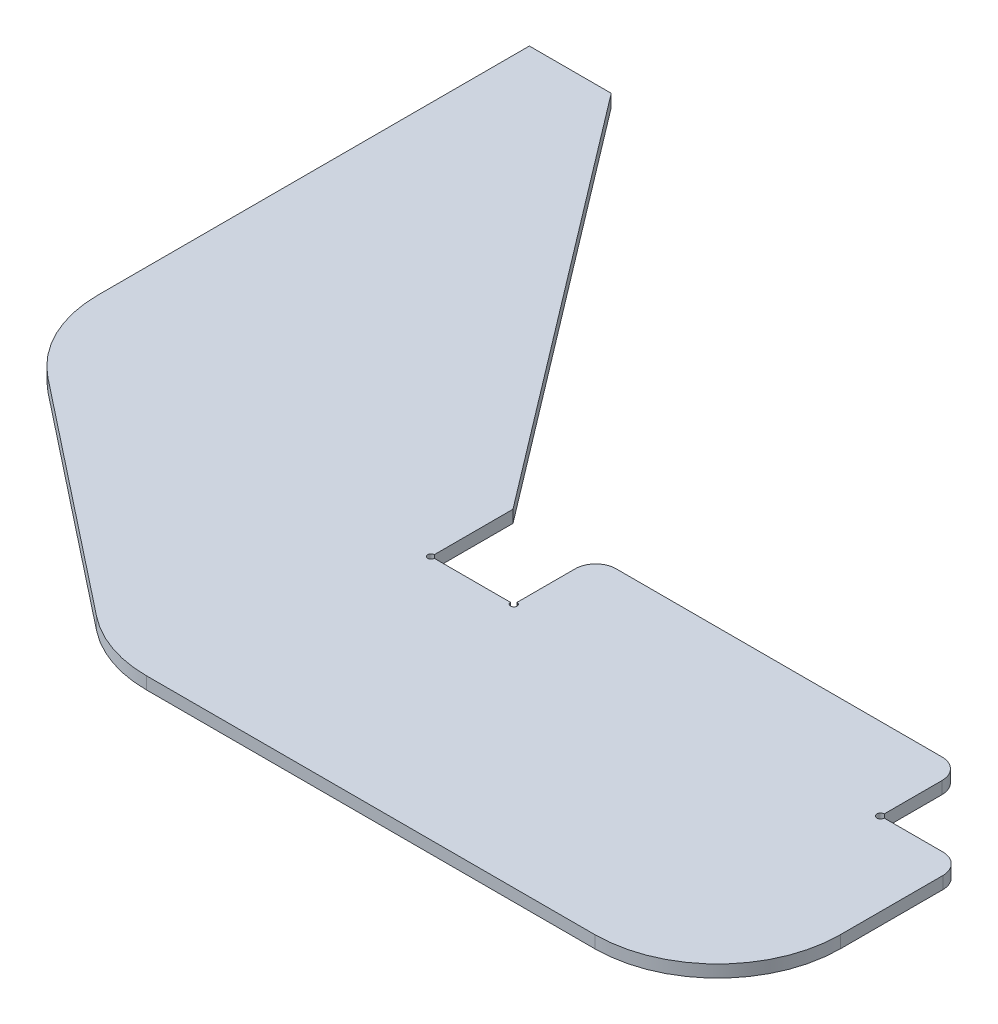
ISO-10303-21;
HEADER;
FILE_DESCRIPTION(('STEP AP214'),'2;1');
FILE_NAME('part.step','',(''),(''),'','','');
FILE_SCHEMA(('AUTOMOTIVE_DESIGN { 1 0 10303 214 1 1 1 1 }'));
ENDSEC;
DATA;
#1=APPLICATION_CONTEXT('core data for automotive mechanical design processes');
#2=APPLICATION_PROTOCOL_DEFINITION('international standard','automotive_design',2000,#1);
#3=PRODUCT_CONTEXT('',#1,'mechanical');
#4=PRODUCT('Part','Part','',(#3));
#5=PRODUCT_RELATED_PRODUCT_CATEGORY('part','',(#4));
#6=PRODUCT_DEFINITION_FORMATION('','',#4);
#7=PRODUCT_DEFINITION_CONTEXT('part definition',#1,'design');
#8=PRODUCT_DEFINITION('design','',#6,#7);
#9=PRODUCT_DEFINITION_SHAPE('','',#8);
#10=(LENGTH_UNIT() NAMED_UNIT(*) SI_UNIT(.MILLI.,.METRE.));
#11=(NAMED_UNIT(*) PLANE_ANGLE_UNIT() SI_UNIT($,.RADIAN.));
#12=(NAMED_UNIT(*) SI_UNIT($,.STERADIAN.) SOLID_ANGLE_UNIT());
#13=UNCERTAINTY_MEASURE_WITH_UNIT(LENGTH_MEASURE(1.E-05),#10,'distance_accuracy_value','');
#14=(GEOMETRIC_REPRESENTATION_CONTEXT(3) GLOBAL_UNCERTAINTY_ASSIGNED_CONTEXT((#13)) GLOBAL_UNIT_ASSIGNED_CONTEXT((#10,
#11,#12)) REPRESENTATION_CONTEXT('',''));
#15=CARTESIAN_POINT('',(0.,0.,0.));
#16=DIRECTION('',(0.,0.,1.));
#17=DIRECTION('',(1.,0.,0.));
#18=AXIS2_PLACEMENT_3D('',#15,#16,#17);
#19=CARTESIAN_POINT('',(-75.,3.,-30.));
#20=DIRECTION('',(0.,0.,1.));
#21=DIRECTION('',(1.,0.,0.));
#22=AXIS2_PLACEMENT_3D('',#19,#20,#21);
#23=PLANE('',#22);
#24=DIRECTION('',(-1.,0.,0.));
#25=VECTOR('',#24,1.);
#26=CARTESIAN_POINT('',(-75.,0.,-30.));
#27=LINE('',#26,#25);
#28=CARTESIAN_POINT('',(-35.6,0.,-30.));
#29=VERTEX_POINT('',#28);
#30=CARTESIAN_POINT('',(-54.2,0.,-30.));
#31=VERTEX_POINT('',#30);
#32=EDGE_CURVE('E224',#29,#31,#27,.T.);
#33=ORIENTED_EDGE('',*,*,#32,.T.);
#34=DIRECTION('',(0.,1.,0.));
#35=VECTOR('',#34,1.);
#36=CARTESIAN_POINT('',(-54.2,0.,-30.));
#37=LINE('',#36,#35);
#38=CARTESIAN_POINT('',(-54.2,3.,-30.));
#39=VERTEX_POINT('',#38);
#40=EDGE_CURVE('E317',#31,#39,#37,.T.);
#41=ORIENTED_EDGE('',*,*,#40,.T.);
#42=DIRECTION('',(-1.,0.,0.));
#43=VECTOR('',#42,1.);
#44=CARTESIAN_POINT('',(-75.,3.,-30.));
#45=LINE('',#44,#43);
#46=CARTESIAN_POINT('',(-35.6,3.,-30.));
#47=VERTEX_POINT('',#46);
#48=EDGE_CURVE('E214',#47,#39,#45,.T.);
#49=ORIENTED_EDGE('',*,*,#48,.F.);
#50=DIRECTION('',(0.,1.,0.));
#51=VECTOR('',#50,1.);
#52=CARTESIAN_POINT('',(-35.6,0.,-30.));
#53=LINE('',#52,#51);
#54=EDGE_CURVE('E359',#47,#29,#53,.F.);
#55=ORIENTED_EDGE('',*,*,#54,.T.);
#56=EDGE_LOOP('',(#33,#41,#49,#55));
#57=FACE_BOUND('',#56,.T.);
#58=ADVANCED_FACE('F35',(#57),#23,.F.);
#59=CARTESIAN_POINT('',(75.,3.,30.));
#60=DIRECTION('',(-1.,0.,0.));
#61=DIRECTION('',(0.,0.,1.));
#62=AXIS2_PLACEMENT_3D('',#59,#60,#61);
#63=PLANE('',#62);
#64=DIRECTION('',(0.,0.,-1.));
#65=VECTOR('',#64,1.);
#66=CARTESIAN_POINT('',(75.,0.,30.));
#67=LINE('',#66,#65);
#68=CARTESIAN_POINT('',(75.,0.,0.));
#69=VERTEX_POINT('',#68);
#70=CARTESIAN_POINT('',(75.,0.,-25.));
#71=VERTEX_POINT('',#70);
#72=EDGE_CURVE('E221',#69,#71,#67,.T.);
#73=ORIENTED_EDGE('',*,*,#72,.T.);
#74=DIRECTION('',(0.,-1.,0.));
#75=VECTOR('',#74,1.);
#76=CARTESIAN_POINT('',(75.,3.,-25.));
#77=LINE('',#76,#75);
#78=CARTESIAN_POINT('',(75.,3.,-25.));
#79=VERTEX_POINT('',#78);
#80=EDGE_CURVE('E271',#71,#79,#77,.F.);
#81=ORIENTED_EDGE('',*,*,#80,.T.);
#82=DIRECTION('',(0.,0.,-1.));
#83=VECTOR('',#82,1.);
#84=CARTESIAN_POINT('',(75.,3.,30.));
#85=LINE('',#84,#83);
#86=CARTESIAN_POINT('',(75.,3.,0.));
#87=VERTEX_POINT('',#86);
#88=EDGE_CURVE('E211',#87,#79,#85,.T.);
#89=ORIENTED_EDGE('',*,*,#88,.F.);
#90=DIRECTION('',(0.,-1.,0.));
#91=VECTOR('',#90,1.);
#92=CARTESIAN_POINT('',(75.,3.,0.));
#93=LINE('',#92,#91);
#94=EDGE_CURVE('E220',#87,#69,#93,.T.);
#95=ORIENTED_EDGE('',*,*,#94,.T.);
#96=EDGE_LOOP('',(#73,#81,#89,#95));
#97=FACE_BOUND('',#96,.T.);
#98=ADVANCED_FACE('F383',(#97),#63,.F.);
#99=CARTESIAN_POINT('',(70.,3.,-30.));
#100=VERTEX_POINT('',#99);
#101=CARTESIAN_POINT('',(55.6994021051872,3.,-30.));
#102=VERTEX_POINT('',#101);
#103=EDGE_CURVE('E216',#100,#102,#45,.T.);
#104=ORIENTED_EDGE('',*,*,#103,.F.);
#105=DIRECTION('',(0.,-1.,0.));
#106=VECTOR('',#105,1.);
#107=CARTESIAN_POINT('',(70.,3.,-30.));
#108=LINE('',#107,#106);
#109=CARTESIAN_POINT('',(70.,0.,-30.));
#110=VERTEX_POINT('',#109);
#111=EDGE_CURVE('E262',#100,#110,#108,.T.);
#112=ORIENTED_EDGE('',*,*,#111,.T.);
#113=CARTESIAN_POINT('',(55.6994021051872,0.,-30.));
#114=VERTEX_POINT('',#113);
#115=EDGE_CURVE('E225',#110,#114,#27,.T.);
#116=ORIENTED_EDGE('',*,*,#115,.T.);
#117=DIRECTION('',(0.,1.,0.));
#118=VECTOR('',#117,1.);
#119=CARTESIAN_POINT('',(55.6994021051872,0.,-30.));
#120=LINE('',#119,#118);
#121=EDGE_CURVE('E345',#114,#102,#120,.T.);
#122=ORIENTED_EDGE('',*,*,#121,.T.);
#123=EDGE_LOOP('',(#104,#112,#116,#122));
#124=FACE_BOUND('',#123,.T.);
#125=ADVANCED_FACE('F385',(#124),#23,.F.);
#126=CARTESIAN_POINT('',(-75.,3.,30.));
#127=DIRECTION('',(0.,0.,-1.));
#128=DIRECTION('',(-1.,0.,0.));
#129=AXIS2_PLACEMENT_3D('',#126,#127,#128);
#130=PLANE('',#129);
#131=DIRECTION('',(1.,0.,0.));
#132=VECTOR('',#131,1.);
#133=CARTESIAN_POINT('',(-75.,3.,30.));
#134=LINE('',#133,#132);
#135=CARTESIAN_POINT('',(-64.5851262523592,3.,30.));
#136=VERTEX_POINT('',#135);
#137=CARTESIAN_POINT('',(45.,3.,30.));
#138=VERTEX_POINT('',#137);
#139=EDGE_CURVE('E218',#136,#138,#134,.T.);
#140=ORIENTED_EDGE('',*,*,#139,.F.);
#141=DIRECTION('',(0.,-1.,0.));
#142=VECTOR('',#141,1.);
#143=CARTESIAN_POINT('',(-64.5851262523592,0.,30.));
#144=LINE('',#143,#142);
#145=CARTESIAN_POINT('',(-64.5851262523592,0.,30.));
#146=VERTEX_POINT('',#145);
#147=EDGE_CURVE('E238',#136,#146,#144,.T.);
#148=ORIENTED_EDGE('',*,*,#147,.T.);
#149=DIRECTION('',(1.,0.,0.));
#150=VECTOR('',#149,1.);
#151=CARTESIAN_POINT('',(-75.,0.,30.));
#152=LINE('',#151,#150);
#153=CARTESIAN_POINT('',(45.,0.,30.));
#154=VERTEX_POINT('',#153);
#155=EDGE_CURVE('E215',#146,#154,#152,.T.);
#156=ORIENTED_EDGE('',*,*,#155,.T.);
#157=DIRECTION('',(0.,-1.,0.));
#158=VECTOR('',#157,1.);
#159=CARTESIAN_POINT('',(45.,3.,30.));
#160=LINE('',#159,#158);
#161=EDGE_CURVE('E233',#154,#138,#160,.F.);
#162=ORIENTED_EDGE('',*,*,#161,.T.);
#163=EDGE_LOOP('',(#140,#148,#156,#162));
#164=FACE_BOUND('',#163,.T.);
#165=ADVANCED_FACE('F393',(#164),#130,.F.);
#166=CARTESIAN_POINT('',(0.,3.,0.));
#167=DIRECTION('',(0.,-1.,0.));
#168=DIRECTION('',(0.,0.,-1.));
#169=AXIS2_PLACEMENT_3D('',#166,#167,#168);
#170=PLANE('',#169);
#171=ORIENTED_EDGE('',*,*,#88,.T.);
#172=CARTESIAN_POINT('',(70.,3.,-25.));
#173=DIRECTION('',(0.,-1.,0.));
#174=DIRECTION('',(0.,0.,-1.));
#175=AXIS2_PLACEMENT_3D('',#172,#173,#174);
#176=CIRCLE('',#175,5.);
#177=EDGE_CURVE('E276',#79,#100,#176,.F.);
#178=ORIENTED_EDGE('',*,*,#177,.T.);
#179=ORIENTED_EDGE('',*,*,#103,.T.);
#180=CARTESIAN_POINT('',(54.8,3.,-30.));
#181=DIRECTION('',(0.,1.,0.));
#182=DIRECTION('',(0.,0.,1.));
#183=AXIS2_PLACEMENT_3D('',#180,#181,#182);
#184=CIRCLE('',#183,0.899402105187145);
#185=CARTESIAN_POINT('',(54.8,3.,-30.8994021051871));
#186=VERTEX_POINT('',#185);
#187=EDGE_CURVE('E310',#186,#102,#184,.T.);
#188=ORIENTED_EDGE('',*,*,#187,.F.);
#189=DIRECTION('',(0.,0.,-1.));
#190=VECTOR('',#189,1.);
#191=CARTESIAN_POINT('',(54.8,3.,0.));
#192=LINE('',#191,#190);
#193=CARTESIAN_POINT('',(54.8,3.,-45.));
#194=VERTEX_POINT('',#193);
#195=EDGE_CURVE('E306',#186,#194,#192,.T.);
#196=ORIENTED_EDGE('',*,*,#195,.T.);
#197=CARTESIAN_POINT('',(49.8,3.,-45.));
#198=DIRECTION('',(0.,-1.,0.));
#199=DIRECTION('',(0.,0.,-1.));
#200=AXIS2_PLACEMENT_3D('',#197,#198,#199);
#201=CIRCLE('',#200,5.);
#202=CARTESIAN_POINT('',(49.8,3.,-50.));
#203=VERTEX_POINT('',#202);
#204=EDGE_CURVE('E274',#194,#203,#201,.F.);
#205=ORIENTED_EDGE('',*,*,#204,.T.);
#206=DIRECTION('',(-1.,0.,0.));
#207=VECTOR('',#206,1.);
#208=CARTESIAN_POINT('',(0.,3.,-50.));
#209=LINE('',#208,#207);
#210=CARTESIAN_POINT('',(-29.8,3.,-50.));
#211=VERTEX_POINT('',#210);
#212=EDGE_CURVE('E289',#203,#211,#209,.T.);
#213=ORIENTED_EDGE('',*,*,#212,.T.);
#214=CARTESIAN_POINT('',(-29.8,3.,-45.));
#215=DIRECTION('',(0.,-1.,0.));
#216=DIRECTION('',(0.,0.,-1.));
#217=AXIS2_PLACEMENT_3D('',#214,#215,#216);
#218=CIRCLE('',#217,5.);
#219=CARTESIAN_POINT('',(-34.8,3.,-45.));
#220=VERTEX_POINT('',#219);
#221=EDGE_CURVE('E50',#211,#220,#218,.F.);
#222=ORIENTED_EDGE('',*,*,#221,.T.);
#223=DIRECTION('',(0.,0.,-1.));
#224=VECTOR('',#223,1.);
#225=CARTESIAN_POINT('',(-34.8,3.,0.));
#226=LINE('',#225,#224);
#227=CARTESIAN_POINT('',(-34.8,3.,-30.8));
#228=VERTEX_POINT('',#227);
#229=EDGE_CURVE('E297',#228,#220,#226,.T.);
#230=ORIENTED_EDGE('',*,*,#229,.F.);
#231=CARTESIAN_POINT('',(-34.8,3.,-30.));
#232=DIRECTION('',(0.,1.,0.));
#233=DIRECTION('',(0.,0.,1.));
#234=AXIS2_PLACEMENT_3D('',#231,#232,#233);
#235=CIRCLE('',#234,0.800000000000003);
#236=EDGE_CURVE('E351',#47,#228,#235,.T.);
#237=ORIENTED_EDGE('',*,*,#236,.F.);
#238=ORIENTED_EDGE('',*,*,#48,.T.);
#239=CARTESIAN_POINT('',(-55.,3.,-30.));
#240=DIRECTION('',(0.,1.,0.));
#241=DIRECTION('',(0.,0.,1.));
#242=AXIS2_PLACEMENT_3D('',#239,#240,#241);
#243=CIRCLE('',#242,0.800000000000003);
#244=CARTESIAN_POINT('',(-55.,3.,-30.8));
#245=VERTEX_POINT('',#244);
#246=EDGE_CURVE('E346',#245,#39,#243,.T.);
#247=ORIENTED_EDGE('',*,*,#246,.F.);
#248=DIRECTION('',(0.,0.,-1.));
#249=VECTOR('',#248,1.);
#250=CARTESIAN_POINT('',(-55.,3.,0.));
#251=LINE('',#250,#249);
#252=CARTESIAN_POINT('',(-55.,3.,-50.));
#253=VERTEX_POINT('',#252);
#254=EDGE_CURVE('E206',#245,#253,#251,.T.);
#255=ORIENTED_EDGE('',*,*,#254,.T.);
#256=DIRECTION('',(-0.605083267533555,0.,-0.796162194123105));
#257=VECTOR('',#256,1.);
#258=CARTESIAN_POINT('',(-130.999999999999,3.,-150.));
#259=LINE('',#258,#257);
#260=CARTESIAN_POINT('',(-130.999999999999,3.,-150.));
#261=VERTEX_POINT('',#260);
#262=EDGE_CURVE('E189',#253,#261,#259,.T.);
#263=ORIENTED_EDGE('',*,*,#262,.T.);
#264=DIRECTION('',(-1.,0.,0.));
#265=VECTOR('',#264,1.);
#266=CARTESIAN_POINT('',(-151.,3.,-150.));
#267=LINE('',#266,#265);
#268=CARTESIAN_POINT('',(-151.,3.,-150.));
#269=VERTEX_POINT('',#268);
#270=EDGE_CURVE('E334',#261,#269,#267,.T.);
#271=ORIENTED_EDGE('',*,*,#270,.T.);
#272=DIRECTION('',(0.,0.,-1.));
#273=VECTOR('',#272,1.);
#274=CARTESIAN_POINT('',(-151.,3.,0.));
#275=LINE('',#274,#273);
#276=CARTESIAN_POINT('',(-151.,3.,-44.5380582218217));
#277=VERTEX_POINT('',#276);
#278=EDGE_CURVE('E198',#277,#269,#275,.T.);
#279=ORIENTED_EDGE('',*,*,#278,.F.);
#280=CARTESIAN_POINT('',(-121.,3.,-44.5380582218217));
#281=DIRECTION('',(0.,-1.,0.));
#282=DIRECTION('',(0.,0.,-1.));
#283=AXIS2_PLACEMENT_3D('',#280,#281,#282);
#284=CIRCLE('',#283,30.);
#285=CARTESIAN_POINT('',(-139.589328657371,3.,-20.9915752558189));
#286=VERTEX_POINT('',#285);
#287=EDGE_CURVE('E249',#277,#286,#284,.F.);
#288=ORIENTED_EDGE('',*,*,#287,.T.);
#289=DIRECTION('',(0.784882765533426,0.,0.619644288579021));
#290=VECTOR('',#289,1.);
#291=CARTESIAN_POINT('',(-43.3873720136519,3.,54.957337883959));
#292=LINE('',#291,#290);
#293=CARTESIAN_POINT('',(-83.1744549097298,3.,23.5464829660028));
#294=VERTEX_POINT('',#293);
#295=EDGE_CURVE('E321',#286,#294,#292,.T.);
#296=ORIENTED_EDGE('',*,*,#295,.T.);
#297=CARTESIAN_POINT('',(-64.5851262523592,3.,0.));
#298=DIRECTION('',(0.,-1.,0.));
#299=DIRECTION('',(0.,0.,-1.));
#300=AXIS2_PLACEMENT_3D('',#297,#298,#299);
#301=CIRCLE('',#300,30.);
#302=EDGE_CURVE('E251',#294,#136,#301,.F.);
#303=ORIENTED_EDGE('',*,*,#302,.T.);
#304=ORIENTED_EDGE('',*,*,#139,.T.);
#305=CARTESIAN_POINT('',(45.,3.,0.));
#306=DIRECTION('',(0.,-1.,0.));
#307=DIRECTION('',(0.,0.,-1.));
#308=AXIS2_PLACEMENT_3D('',#305,#306,#307);
#309=CIRCLE('',#308,30.);
#310=EDGE_CURVE('E236',#138,#87,#309,.F.);
#311=ORIENTED_EDGE('',*,*,#310,.T.);
#312=EDGE_LOOP('',(#171,#178,#179,#188,#196,#205,#213,#222,#230,#237,#238,#247,#255,#263,#271,
#279,#288,#296,#303,#304,#311));
#313=FACE_BOUND('',#312,.T.);
#314=ADVANCED_FACE('F308',(#313),#170,.F.);
#315=CARTESIAN_POINT('',(0.,0.,0.));
#316=DIRECTION('',(0.,-1.,0.));
#317=DIRECTION('',(0.,0.,-1.));
#318=AXIS2_PLACEMENT_3D('',#315,#316,#317);
#319=PLANE('',#318);
#320=ORIENTED_EDGE('',*,*,#115,.F.);
#321=CARTESIAN_POINT('',(70.,0.,-25.));
#322=DIRECTION('',(0.,-1.,0.));
#323=DIRECTION('',(0.,0.,-1.));
#324=AXIS2_PLACEMENT_3D('',#321,#322,#323);
#325=CIRCLE('',#324,5.);
#326=EDGE_CURVE('E269',#110,#71,#325,.T.);
#327=ORIENTED_EDGE('',*,*,#326,.T.);
#328=ORIENTED_EDGE('',*,*,#72,.F.);
#329=CARTESIAN_POINT('',(45.,0.,0.));
#330=DIRECTION('',(0.,-1.,0.));
#331=DIRECTION('',(0.,0.,-1.));
#332=AXIS2_PLACEMENT_3D('',#329,#330,#331);
#333=CIRCLE('',#332,30.);
#334=EDGE_CURVE('E230',#69,#154,#333,.T.);
#335=ORIENTED_EDGE('',*,*,#334,.T.);
#336=ORIENTED_EDGE('',*,*,#155,.F.);
#337=CARTESIAN_POINT('',(-64.5851262523592,0.,0.));
#338=DIRECTION('',(0.,-1.,0.));
#339=DIRECTION('',(0.,0.,-1.));
#340=AXIS2_PLACEMENT_3D('',#337,#338,#339);
#341=CIRCLE('',#340,30.);
#342=CARTESIAN_POINT('',(-83.1744549097298,0.,23.5464829660028));
#343=VERTEX_POINT('',#342);
#344=EDGE_CURVE('E243',#146,#343,#341,.T.);
#345=ORIENTED_EDGE('',*,*,#344,.T.);
#346=DIRECTION('',(0.784882765533426,0.,0.619644288579021));
#347=VECTOR('',#346,1.);
#348=CARTESIAN_POINT('',(-43.3873720136519,0.,54.957337883959));
#349=LINE('',#348,#347);
#350=CARTESIAN_POINT('',(-139.589328657371,0.,-20.9915752558189));
#351=VERTEX_POINT('',#350);
#352=EDGE_CURVE('E203',#351,#343,#349,.T.);
#353=ORIENTED_EDGE('',*,*,#352,.F.);
#354=CARTESIAN_POINT('',(-121.,0.,-44.5380582218217));
#355=DIRECTION('',(0.,-1.,0.));
#356=DIRECTION('',(0.,0.,-1.));
#357=AXIS2_PLACEMENT_3D('',#354,#355,#356);
#358=CIRCLE('',#357,30.);
#359=CARTESIAN_POINT('',(-151.,0.,-44.5380582218217));
#360=VERTEX_POINT('',#359);
#361=EDGE_CURVE('E241',#351,#360,#358,.T.);
#362=ORIENTED_EDGE('',*,*,#361,.T.);
#363=DIRECTION('',(0.,0.,-1.));
#364=VECTOR('',#363,1.);
#365=CARTESIAN_POINT('',(-151.,0.,0.));
#366=LINE('',#365,#364);
#367=CARTESIAN_POINT('',(-151.,0.,-150.));
#368=VERTEX_POINT('',#367);
#369=EDGE_CURVE('E209',#360,#368,#366,.T.);
#370=ORIENTED_EDGE('',*,*,#369,.T.);
#371=DIRECTION('',(1.,0.,0.));
#372=VECTOR('',#371,1.);
#373=CARTESIAN_POINT('',(-151.,0.,-150.));
#374=LINE('',#373,#372);
#375=CARTESIAN_POINT('',(-130.999999999999,0.,-150.));
#376=VERTEX_POINT('',#375);
#377=EDGE_CURVE('E186',#368,#376,#374,.T.);
#378=ORIENTED_EDGE('',*,*,#377,.T.);
#379=DIRECTION('',(-0.605083267533555,0.,-0.796162194123105));
#380=VECTOR('',#379,1.);
#381=CARTESIAN_POINT('',(-130.999999999999,0.,-150.));
#382=LINE('',#381,#380);
#383=CARTESIAN_POINT('',(-55.,0.,-50.));
#384=VERTEX_POINT('',#383);
#385=EDGE_CURVE('E178',#384,#376,#382,.T.);
#386=ORIENTED_EDGE('',*,*,#385,.F.);
#387=DIRECTION('',(0.,0.,-1.));
#388=VECTOR('',#387,1.);
#389=CARTESIAN_POINT('',(-55.,0.,0.));
#390=LINE('',#389,#388);
#391=CARTESIAN_POINT('',(-55.,0.,-30.8));
#392=VERTEX_POINT('',#391);
#393=EDGE_CURVE('E184',#392,#384,#390,.T.);
#394=ORIENTED_EDGE('',*,*,#393,.F.);
#395=CARTESIAN_POINT('',(-55.,0.,-30.));
#396=DIRECTION('',(0.,1.,0.));
#397=DIRECTION('',(0.,0.,1.));
#398=AXIS2_PLACEMENT_3D('',#395,#396,#397);
#399=CIRCLE('',#398,0.800000000000003);
#400=EDGE_CURVE('E343',#392,#31,#399,.T.);
#401=ORIENTED_EDGE('',*,*,#400,.T.);
#402=ORIENTED_EDGE('',*,*,#32,.F.);
#403=CARTESIAN_POINT('',(-34.8,0.,-30.));
#404=DIRECTION('',(0.,1.,0.));
#405=DIRECTION('',(0.,0.,1.));
#406=AXIS2_PLACEMENT_3D('',#403,#404,#405);
#407=CIRCLE('',#406,0.800000000000003);
#408=CARTESIAN_POINT('',(-34.8,0.,-30.8));
#409=VERTEX_POINT('',#408);
#410=EDGE_CURVE('E348',#29,#409,#407,.T.);
#411=ORIENTED_EDGE('',*,*,#410,.T.);
#412=DIRECTION('',(0.,0.,-1.));
#413=VECTOR('',#412,1.);
#414=CARTESIAN_POINT('',(-34.8,0.,0.));
#415=LINE('',#414,#413);
#416=CARTESIAN_POINT('',(-34.8,0.,-45.));
#417=VERTEX_POINT('',#416);
#418=EDGE_CURVE('E312',#409,#417,#415,.T.);
#419=ORIENTED_EDGE('',*,*,#418,.T.);
#420=CARTESIAN_POINT('',(-29.8,0.,-45.));
#421=DIRECTION('',(0.,-1.,0.));
#422=DIRECTION('',(0.,0.,-1.));
#423=AXIS2_PLACEMENT_3D('',#420,#421,#422);
#424=CIRCLE('',#423,5.);
#425=CARTESIAN_POINT('',(-29.8,0.,-50.));
#426=VERTEX_POINT('',#425);
#427=EDGE_CURVE('E265',#417,#426,#424,.T.);
#428=ORIENTED_EDGE('',*,*,#427,.T.);
#429=DIRECTION('',(-1.,0.,0.));
#430=VECTOR('',#429,1.);
#431=CARTESIAN_POINT('',(0.,0.,-50.));
#432=LINE('',#431,#430);
#433=CARTESIAN_POINT('',(49.8,0.,-50.));
#434=VERTEX_POINT('',#433);
#435=EDGE_CURVE('E288',#434,#426,#432,.T.);
#436=ORIENTED_EDGE('',*,*,#435,.F.);
#437=CARTESIAN_POINT('',(49.8,0.,-45.));
#438=DIRECTION('',(0.,-1.,0.));
#439=DIRECTION('',(0.,0.,-1.));
#440=AXIS2_PLACEMENT_3D('',#437,#438,#439);
#441=CIRCLE('',#440,5.);
#442=CARTESIAN_POINT('',(54.8,0.,-45.));
#443=VERTEX_POINT('',#442);
#444=EDGE_CURVE('E267',#434,#443,#441,.T.);
#445=ORIENTED_EDGE('',*,*,#444,.T.);
#446=DIRECTION('',(0.,0.,-1.));
#447=VECTOR('',#446,1.);
#448=CARTESIAN_POINT('',(54.8,0.,0.));
#449=LINE('',#448,#447);
#450=CARTESIAN_POINT('',(54.8,0.,-30.8994021051871));
#451=VERTEX_POINT('',#450);
#452=EDGE_CURVE('E296',#451,#443,#449,.T.);
#453=ORIENTED_EDGE('',*,*,#452,.F.);
#454=CARTESIAN_POINT('',(54.8,0.,-30.));
#455=DIRECTION('',(0.,1.,0.));
#456=DIRECTION('',(0.,0.,1.));
#457=AXIS2_PLACEMENT_3D('',#454,#455,#456);
#458=CIRCLE('',#457,0.899402105187145);
#459=EDGE_CURVE('E353',#451,#114,#458,.T.);
#460=ORIENTED_EDGE('',*,*,#459,.T.);
#461=EDGE_LOOP('',(#320,#327,#328,#335,#336,#345,#353,#362,#370,#378,#386,#394,#401,#402,#411,
#419,#428,#436,#445,#453,#460));
#462=FACE_BOUND('',#461,.T.);
#463=ADVANCED_FACE('F181',(#462),#319,.T.);
#464=CARTESIAN_POINT('',(45.,3.,0.));
#465=DIRECTION('',(0.,-1.,0.));
#466=DIRECTION('',(0.,0.,-1.));
#467=AXIS2_PLACEMENT_3D('',#464,#465,#466);
#468=CYLINDRICAL_SURFACE('',#467,30.);
#469=ORIENTED_EDGE('',*,*,#310,.F.);
#470=ORIENTED_EDGE('',*,*,#161,.F.);
#471=ORIENTED_EDGE('',*,*,#334,.F.);
#472=ORIENTED_EDGE('',*,*,#94,.F.);
#473=EDGE_LOOP('',(#469,#470,#471,#472));
#474=FACE_BOUND('',#473,.T.);
#475=ADVANCED_FACE('F410',(#474),#468,.T.);
#476=CARTESIAN_POINT('',(-43.3873720136519,-124.963994814506,54.957337883959));
#477=DIRECTION('',(-0.619644288579021,0.,0.784882765533426));
#478=DIRECTION('',(0.784882765533426,0.,0.619644288579021));
#479=AXIS2_PLACEMENT_3D('',#476,#477,#478);
#480=PLANE('',#479);
#481=ORIENTED_EDGE('',*,*,#352,.T.);
#482=DIRECTION('',(0.,-1.,0.));
#483=VECTOR('',#482,1.);
#484=CARTESIAN_POINT('',(-83.1744549097298,3.,23.5464829660028));
#485=LINE('',#484,#483);
#486=EDGE_CURVE('E247',#343,#294,#485,.F.);
#487=ORIENTED_EDGE('',*,*,#486,.T.);
#488=ORIENTED_EDGE('',*,*,#295,.F.);
#489=DIRECTION('',(0.,1.,0.));
#490=VECTOR('',#489,1.);
#491=CARTESIAN_POINT('',(-139.589328657371,0.,-20.9915752558189));
#492=LINE('',#491,#490);
#493=EDGE_CURVE('E245',#286,#351,#492,.F.);
#494=ORIENTED_EDGE('',*,*,#493,.T.);
#495=EDGE_LOOP('',(#481,#487,#488,#494));
#496=FACE_BOUND('',#495,.T.);
#497=ADVANCED_FACE('F422',(#496),#480,.T.);
#498=CARTESIAN_POINT('',(-55.,-124.963994814506,0.));
#499=DIRECTION('',(1.,0.,0.));
#500=DIRECTION('',(0.,0.,-1.));
#501=AXIS2_PLACEMENT_3D('',#498,#499,#500);
#502=PLANE('',#501);
#503=DIRECTION('',(0.,1.,0.));
#504=VECTOR('',#503,1.);
#505=CARTESIAN_POINT('',(-55.,0.,-30.8));
#506=LINE('',#505,#504);
#507=EDGE_CURVE('E202',#392,#245,#506,.T.);
#508=ORIENTED_EDGE('',*,*,#507,.F.);
#509=ORIENTED_EDGE('',*,*,#393,.T.);
#510=DIRECTION('',(0.,1.,0.));
#511=VECTOR('',#510,1.);
#512=CARTESIAN_POINT('',(-55.,-124.963994814506,-50.));
#513=LINE('',#512,#511);
#514=EDGE_CURVE('E192',#384,#253,#513,.T.);
#515=ORIENTED_EDGE('',*,*,#514,.T.);
#516=ORIENTED_EDGE('',*,*,#254,.F.);
#517=EDGE_LOOP('',(#508,#509,#515,#516));
#518=FACE_BOUND('',#517,.T.);
#519=ADVANCED_FACE('F201',(#518),#502,.T.);
#520=CARTESIAN_POINT('',(-151.,-124.963994814506,0.));
#521=DIRECTION('',(1.,0.,0.));
#522=DIRECTION('',(0.,0.,-1.));
#523=AXIS2_PLACEMENT_3D('',#520,#521,#522);
#524=PLANE('',#523);
#525=ORIENTED_EDGE('',*,*,#369,.F.);
#526=DIRECTION('',(0.,1.,0.));
#527=VECTOR('',#526,1.);
#528=CARTESIAN_POINT('',(-151.,3.,-44.5380582218217));
#529=LINE('',#528,#527);
#530=EDGE_CURVE('E253',#360,#277,#529,.T.);
#531=ORIENTED_EDGE('',*,*,#530,.T.);
#532=ORIENTED_EDGE('',*,*,#278,.T.);
#533=DIRECTION('',(0.,-1.,0.));
#534=VECTOR('',#533,1.);
#535=CARTESIAN_POINT('',(-151.,104.980390271856,-150.));
#536=LINE('',#535,#534);
#537=EDGE_CURVE('E331',#269,#368,#536,.T.);
#538=ORIENTED_EDGE('',*,*,#537,.T.);
#539=EDGE_LOOP('',(#525,#531,#532,#538));
#540=FACE_BOUND('',#539,.T.);
#541=ADVANCED_FACE('F329',(#540),#524,.F.);
#542=CARTESIAN_POINT('',(-34.8,-124.963994814506,0.));
#543=DIRECTION('',(1.,0.,0.));
#544=DIRECTION('',(0.,0.,-1.));
#545=AXIS2_PLACEMENT_3D('',#542,#543,#544);
#546=PLANE('',#545);
#547=ORIENTED_EDGE('',*,*,#229,.T.);
#548=DIRECTION('',(0.,1.,0.));
#549=VECTOR('',#548,1.);
#550=CARTESIAN_POINT('',(-34.8,0.,-45.));
#551=LINE('',#550,#549);
#552=EDGE_CURVE('E11',#220,#417,#551,.F.);
#553=ORIENTED_EDGE('',*,*,#552,.T.);
#554=ORIENTED_EDGE('',*,*,#418,.F.);
#555=DIRECTION('',(0.,1.,0.));
#556=VECTOR('',#555,1.);
#557=CARTESIAN_POINT('',(-34.8,0.,-30.8));
#558=LINE('',#557,#556);
#559=EDGE_CURVE('E258',#409,#228,#558,.T.);
#560=ORIENTED_EDGE('',*,*,#559,.T.);
#561=EDGE_LOOP('',(#547,#553,#554,#560));
#562=FACE_BOUND('',#561,.T.);
#563=ADVANCED_FACE('F374',(#562),#546,.F.);
#564=CARTESIAN_POINT('',(0.,-124.963994814506,-50.));
#565=DIRECTION('',(0.,0.,-1.));
#566=DIRECTION('',(-1.,0.,0.));
#567=AXIS2_PLACEMENT_3D('',#564,#565,#566);
#568=PLANE('',#567);
#569=ORIENTED_EDGE('',*,*,#212,.F.);
#570=DIRECTION('',(0.,1.,0.));
#571=VECTOR('',#570,1.);
#572=CARTESIAN_POINT('',(49.8,-124.963994814506,-50.));
#573=LINE('',#572,#571);
#574=EDGE_CURVE('E43',#203,#434,#573,.F.);
#575=ORIENTED_EDGE('',*,*,#574,.T.);
#576=ORIENTED_EDGE('',*,*,#435,.T.);
#577=DIRECTION('',(0.,1.,0.));
#578=VECTOR('',#577,1.);
#579=CARTESIAN_POINT('',(-29.8,3.,-50.));
#580=LINE('',#579,#578);
#581=EDGE_CURVE('E281',#426,#211,#580,.T.);
#582=ORIENTED_EDGE('',*,*,#581,.T.);
#583=EDGE_LOOP('',(#569,#575,#576,#582));
#584=FACE_BOUND('',#583,.T.);
#585=ADVANCED_FACE('F287',(#584),#568,.T.);
#586=CARTESIAN_POINT('',(54.8,-124.963994814506,0.));
#587=DIRECTION('',(1.,0.,0.));
#588=DIRECTION('',(0.,0.,-1.));
#589=AXIS2_PLACEMENT_3D('',#586,#587,#588);
#590=PLANE('',#589);
#591=ORIENTED_EDGE('',*,*,#452,.T.);
#592=DIRECTION('',(0.,1.,0.));
#593=VECTOR('',#592,1.);
#594=CARTESIAN_POINT('',(54.8,-124.963994814506,-45.));
#595=LINE('',#594,#593);
#596=EDGE_CURVE('E278',#443,#194,#595,.T.);
#597=ORIENTED_EDGE('',*,*,#596,.T.);
#598=ORIENTED_EDGE('',*,*,#195,.F.);
#599=DIRECTION('',(0.,1.,0.));
#600=VECTOR('',#599,1.);
#601=CARTESIAN_POINT('',(54.8,0.,-30.8994021051871));
#602=LINE('',#601,#600);
#603=EDGE_CURVE('E256',#451,#186,#602,.T.);
#604=ORIENTED_EDGE('',*,*,#603,.F.);
#605=EDGE_LOOP('',(#591,#597,#598,#604));
#606=FACE_BOUND('',#605,.T.);
#607=ADVANCED_FACE('F304',(#606),#590,.T.);
#608=CARTESIAN_POINT('',(-64.5851262523592,3.,0.));
#609=DIRECTION('',(0.,1.,0.));
#610=DIRECTION('',(0.,0.,1.));
#611=AXIS2_PLACEMENT_3D('',#608,#609,#610);
#612=CYLINDRICAL_SURFACE('',#611,30.);
#613=ORIENTED_EDGE('',*,*,#302,.F.);
#614=ORIENTED_EDGE('',*,*,#486,.F.);
#615=ORIENTED_EDGE('',*,*,#344,.F.);
#616=ORIENTED_EDGE('',*,*,#147,.F.);
#617=EDGE_LOOP('',(#613,#614,#615,#616));
#618=FACE_BOUND('',#617,.T.);
#619=ADVANCED_FACE('F418',(#618),#612,.T.);
#620=CARTESIAN_POINT('',(-121.,-124.963994814506,-44.5380582218217));
#621=DIRECTION('',(0.,-1.,0.));
#622=DIRECTION('',(0.,0.,-1.));
#623=AXIS2_PLACEMENT_3D('',#620,#621,#622);
#624=CYLINDRICAL_SURFACE('',#623,30.);
#625=ORIENTED_EDGE('',*,*,#361,.F.);
#626=ORIENTED_EDGE('',*,*,#493,.F.);
#627=ORIENTED_EDGE('',*,*,#287,.F.);
#628=ORIENTED_EDGE('',*,*,#530,.F.);
#629=EDGE_LOOP('',(#625,#626,#627,#628));
#630=FACE_BOUND('',#629,.T.);
#631=ADVANCED_FACE('F426',(#630),#624,.T.);
#632=CARTESIAN_POINT('',(54.8,0.,-30.));
#633=DIRECTION('',(0.,1.,0.));
#634=DIRECTION('',(0.,0.,1.));
#635=AXIS2_PLACEMENT_3D('',#632,#633,#634);
#636=CYLINDRICAL_SURFACE('',#635,0.899402105187145);
#637=ORIENTED_EDGE('',*,*,#459,.F.);
#638=ORIENTED_EDGE('',*,*,#603,.T.);
#639=ORIENTED_EDGE('',*,*,#187,.T.);
#640=ORIENTED_EDGE('',*,*,#121,.F.);
#641=EDGE_LOOP('',(#637,#638,#639,#640));
#642=FACE_BOUND('',#641,.T.);
#643=ADVANCED_FACE('F428',(#642),#636,.F.);
#644=CARTESIAN_POINT('',(-34.8,0.,-30.));
#645=DIRECTION('',(0.,1.,0.));
#646=DIRECTION('',(0.,0.,1.));
#647=AXIS2_PLACEMENT_3D('',#644,#645,#646);
#648=CYLINDRICAL_SURFACE('',#647,0.800000000000003);
#649=ORIENTED_EDGE('',*,*,#236,.T.);
#650=ORIENTED_EDGE('',*,*,#559,.F.);
#651=ORIENTED_EDGE('',*,*,#410,.F.);
#652=ORIENTED_EDGE('',*,*,#54,.F.);
#653=EDGE_LOOP('',(#649,#650,#651,#652));
#654=FACE_BOUND('',#653,.T.);
#655=ADVANCED_FACE('F371',(#654),#648,.F.);
#656=CARTESIAN_POINT('',(-55.,0.,-30.));
#657=DIRECTION('',(0.,1.,0.));
#658=DIRECTION('',(0.,0.,1.));
#659=AXIS2_PLACEMENT_3D('',#656,#657,#658);
#660=CYLINDRICAL_SURFACE('',#659,0.800000000000003);
#661=ORIENTED_EDGE('',*,*,#400,.F.);
#662=ORIENTED_EDGE('',*,*,#507,.T.);
#663=ORIENTED_EDGE('',*,*,#246,.T.);
#664=ORIENTED_EDGE('',*,*,#40,.F.);
#665=EDGE_LOOP('',(#661,#662,#663,#664));
#666=FACE_BOUND('',#665,.T.);
#667=ADVANCED_FACE('F440',(#666),#660,.F.);
#668=CARTESIAN_POINT('',(70.,3.,-25.));
#669=DIRECTION('',(0.,-1.,0.));
#670=DIRECTION('',(0.,0.,-1.));
#671=AXIS2_PLACEMENT_3D('',#668,#669,#670);
#672=CYLINDRICAL_SURFACE('',#671,5.);
#673=ORIENTED_EDGE('',*,*,#177,.F.);
#674=ORIENTED_EDGE('',*,*,#80,.F.);
#675=ORIENTED_EDGE('',*,*,#326,.F.);
#676=ORIENTED_EDGE('',*,*,#111,.F.);
#677=EDGE_LOOP('',(#673,#674,#675,#676));
#678=FACE_BOUND('',#677,.T.);
#679=ADVANCED_FACE('F381',(#678),#672,.T.);
#680=CARTESIAN_POINT('',(49.8,-124.963994814506,-45.));
#681=DIRECTION('',(0.,1.,0.));
#682=DIRECTION('',(0.,0.,1.));
#683=AXIS2_PLACEMENT_3D('',#680,#681,#682);
#684=CYLINDRICAL_SURFACE('',#683,5.);
#685=ORIENTED_EDGE('',*,*,#444,.F.);
#686=ORIENTED_EDGE('',*,*,#574,.F.);
#687=ORIENTED_EDGE('',*,*,#204,.F.);
#688=ORIENTED_EDGE('',*,*,#596,.F.);
#689=EDGE_LOOP('',(#685,#686,#687,#688));
#690=FACE_BOUND('',#689,.T.);
#691=ADVANCED_FACE('F300',(#690),#684,.T.);
#692=CARTESIAN_POINT('',(-29.8,-124.963994814506,-45.));
#693=DIRECTION('',(0.,-1.,0.));
#694=DIRECTION('',(0.,0.,-1.));
#695=AXIS2_PLACEMENT_3D('',#692,#693,#694);
#696=CYLINDRICAL_SURFACE('',#695,5.);
#697=ORIENTED_EDGE('',*,*,#427,.F.);
#698=ORIENTED_EDGE('',*,*,#552,.F.);
#699=ORIENTED_EDGE('',*,*,#221,.F.);
#700=ORIENTED_EDGE('',*,*,#581,.F.);
#701=EDGE_LOOP('',(#697,#698,#699,#700));
#702=FACE_BOUND('',#701,.T.);
#703=ADVANCED_FACE('F37',(#702),#696,.T.);
#704=CARTESIAN_POINT('',(-151.,104.980390271856,-150.));
#705=DIRECTION('',(0.,0.,-1.));
#706=DIRECTION('',(-1.,0.,0.));
#707=AXIS2_PLACEMENT_3D('',#704,#705,#706);
#708=PLANE('',#707);
#709=ORIENTED_EDGE('',*,*,#270,.F.);
#710=DIRECTION('',(0.,-1.,0.));
#711=VECTOR('',#710,1.);
#712=CARTESIAN_POINT('',(-130.999999999999,104.980390271856,-150.));
#713=LINE('',#712,#711);
#714=EDGE_CURVE('E336',#261,#376,#713,.T.);
#715=ORIENTED_EDGE('',*,*,#714,.T.);
#716=ORIENTED_EDGE('',*,*,#377,.F.);
#717=ORIENTED_EDGE('',*,*,#537,.F.);
#718=EDGE_LOOP('',(#709,#715,#716,#717));
#719=FACE_BOUND('',#718,.T.);
#720=ADVANCED_FACE('F338',(#719),#708,.T.);
#721=CARTESIAN_POINT('',(-130.999999999999,-125.60254774486,-150.));
#722=DIRECTION('',(0.796162194123105,0.,-0.605083267533555));
#723=DIRECTION('',(-0.605083267533555,0.,-0.796162194123105));
#724=AXIS2_PLACEMENT_3D('',#721,#722,#723);
#725=PLANE('',#724);
#726=ORIENTED_EDGE('',*,*,#514,.F.);
#727=ORIENTED_EDGE('',*,*,#385,.T.);
#728=ORIENTED_EDGE('',*,*,#714,.F.);
#729=ORIENTED_EDGE('',*,*,#262,.F.);
#730=EDGE_LOOP('',(#726,#727,#728,#729));
#731=FACE_BOUND('',#730,.T.);
#732=ADVANCED_FACE('F193',(#731),#725,.T.);
#733=CLOSED_SHELL('',(#58,#98,#125,#165,#314,#463,#475,#497,#519,#541,#563,#585,#607,#619,#631,
#643,#655,#667,#679,#691,#703,#720,#732));
#734=MANIFOLD_SOLID_BREP('B2',#733);
#735=ADVANCED_BREP_SHAPE_REPRESENTATION('',(#18,#734),#14);
#736=SHAPE_DEFINITION_REPRESENTATION(#9,#735);
ENDSEC;
END-ISO-10303-21;
